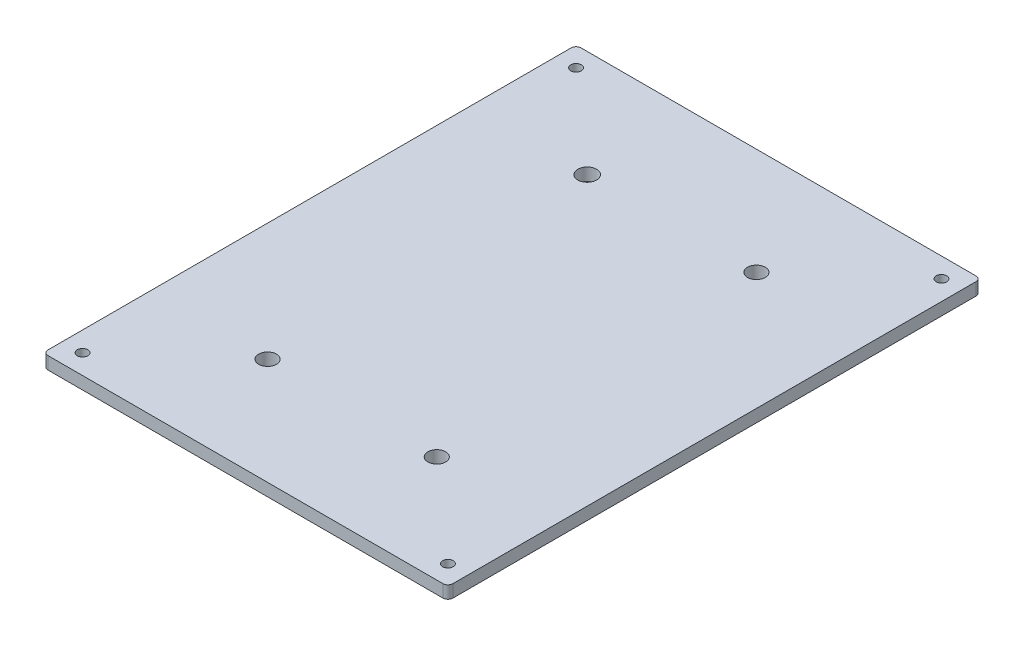
ISO-10303-21;
HEADER;
FILE_DESCRIPTION(('STEP AP214'),'2;1');
FILE_NAME('part.step','',(''),(''),'','','');
FILE_SCHEMA(('AUTOMOTIVE_DESIGN { 1 0 10303 214 1 1 1 1 }'));
ENDSEC;
DATA;
#1=APPLICATION_CONTEXT('core data for automotive mechanical design processes');
#2=APPLICATION_PROTOCOL_DEFINITION('international standard','automotive_design',2000,#1);
#3=PRODUCT_CONTEXT('',#1,'mechanical');
#4=PRODUCT('Part','Part','',(#3));
#5=PRODUCT_RELATED_PRODUCT_CATEGORY('part','',(#4));
#6=PRODUCT_DEFINITION_FORMATION('','',#4);
#7=PRODUCT_DEFINITION_CONTEXT('part definition',#1,'design');
#8=PRODUCT_DEFINITION('design','',#6,#7);
#9=PRODUCT_DEFINITION_SHAPE('','',#8);
#10=(LENGTH_UNIT() NAMED_UNIT(*) SI_UNIT(.MILLI.,.METRE.));
#11=(NAMED_UNIT(*) PLANE_ANGLE_UNIT() SI_UNIT($,.RADIAN.));
#12=(NAMED_UNIT(*) SI_UNIT($,.STERADIAN.) SOLID_ANGLE_UNIT());
#13=UNCERTAINTY_MEASURE_WITH_UNIT(LENGTH_MEASURE(1.E-05),#10,'distance_accuracy_value','');
#14=(GEOMETRIC_REPRESENTATION_CONTEXT(3) GLOBAL_UNCERTAINTY_ASSIGNED_CONTEXT((#13)) GLOBAL_UNIT_ASSIGNED_CONTEXT((#10,
#11,#12)) REPRESENTATION_CONTEXT('',''));
#15=CARTESIAN_POINT('',(0.,0.,0.));
#16=DIRECTION('',(0.,0.,1.));
#17=DIRECTION('',(1.,0.,0.));
#18=AXIS2_PLACEMENT_3D('',#15,#16,#17);
#19=CARTESIAN_POINT('',(-102.55,6.35,-135.));
#20=DIRECTION('',(1.,0.,0.));
#21=DIRECTION('',(0.,0.,-1.));
#22=AXIS2_PLACEMENT_3D('',#19,#20,#21);
#23=PLANE('',#22);
#24=DIRECTION('',(0.,0.,1.));
#25=VECTOR('',#24,1.);
#26=CARTESIAN_POINT('',(-102.55,6.35,-135.));
#27=LINE('',#26,#25);
#28=CARTESIAN_POINT('',(-102.55,6.35,-132.46));
#29=VERTEX_POINT('',#28);
#30=CARTESIAN_POINT('',(-102.55,6.35,132.46));
#31=VERTEX_POINT('',#30);
#32=EDGE_CURVE('E122',#29,#31,#27,.T.);
#33=ORIENTED_EDGE('',*,*,#32,.F.);
#34=DIRECTION('',(0.,-1.,0.));
#35=VECTOR('',#34,1.);
#36=CARTESIAN_POINT('',(-102.55,6.35,-132.46));
#37=LINE('',#36,#35);
#38=CARTESIAN_POINT('',(-102.55,0.,-132.46));
#39=VERTEX_POINT('',#38);
#40=EDGE_CURVE('E107',#29,#39,#37,.T.);
#41=ORIENTED_EDGE('',*,*,#40,.T.);
#42=DIRECTION('',(0.,0.,1.));
#43=VECTOR('',#42,1.);
#44=CARTESIAN_POINT('',(-102.55,0.,-135.));
#45=LINE('',#44,#43);
#46=CARTESIAN_POINT('',(-102.55,0.,132.46));
#47=VERTEX_POINT('',#46);
#48=EDGE_CURVE('E119',#39,#47,#45,.T.);
#49=ORIENTED_EDGE('',*,*,#48,.T.);
#50=DIRECTION('',(0.,-1.,0.));
#51=VECTOR('',#50,1.);
#52=CARTESIAN_POINT('',(-102.55,6.35,132.46));
#53=LINE('',#52,#51);
#54=EDGE_CURVE('E124',#47,#31,#53,.F.);
#55=ORIENTED_EDGE('',*,*,#54,.T.);
#56=EDGE_LOOP('',(#33,#41,#49,#55));
#57=FACE_BOUND('',#56,.T.);
#58=ADVANCED_FACE('F37',(#57),#23,.F.);
#59=CARTESIAN_POINT('',(102.55,6.35,135.));
#60=DIRECTION('',(0.,0.,-1.));
#61=DIRECTION('',(-1.,0.,0.));
#62=AXIS2_PLACEMENT_3D('',#59,#60,#61);
#63=PLANE('',#62);
#64=DIRECTION('',(1.,0.,0.));
#65=VECTOR('',#64,1.);
#66=CARTESIAN_POINT('',(102.55,0.,135.));
#67=LINE('',#66,#65);
#68=CARTESIAN_POINT('',(-100.01,0.,135.));
#69=VERTEX_POINT('',#68);
#70=CARTESIAN_POINT('',(100.01,0.,135.));
#71=VERTEX_POINT('',#70);
#72=EDGE_CURVE('E128',#69,#71,#67,.T.);
#73=ORIENTED_EDGE('',*,*,#72,.T.);
#74=DIRECTION('',(0.,-1.,0.));
#75=VECTOR('',#74,1.);
#76=CARTESIAN_POINT('',(100.01,6.35,135.));
#77=LINE('',#76,#75);
#78=CARTESIAN_POINT('',(100.01,6.35,135.));
#79=VERTEX_POINT('',#78);
#80=EDGE_CURVE('E11',#71,#79,#77,.F.);
#81=ORIENTED_EDGE('',*,*,#80,.T.);
#82=DIRECTION('',(1.,0.,0.));
#83=VECTOR('',#82,1.);
#84=CARTESIAN_POINT('',(102.55,6.35,135.));
#85=LINE('',#84,#83);
#86=CARTESIAN_POINT('',(-100.01,6.35,135.));
#87=VERTEX_POINT('',#86);
#88=EDGE_CURVE('E168',#87,#79,#85,.T.);
#89=ORIENTED_EDGE('',*,*,#88,.F.);
#90=DIRECTION('',(0.,-1.,0.));
#91=VECTOR('',#90,1.);
#92=CARTESIAN_POINT('',(-100.01,6.35,135.));
#93=LINE('',#92,#91);
#94=EDGE_CURVE('E45',#87,#69,#93,.T.);
#95=ORIENTED_EDGE('',*,*,#94,.T.);
#96=EDGE_LOOP('',(#73,#81,#89,#95));
#97=FACE_BOUND('',#96,.T.);
#98=ADVANCED_FACE('F166',(#97),#63,.F.);
#99=CARTESIAN_POINT('',(102.55,6.35,-135.));
#100=DIRECTION('',(-1.,0.,0.));
#101=DIRECTION('',(0.,0.,1.));
#102=AXIS2_PLACEMENT_3D('',#99,#100,#101);
#103=PLANE('',#102);
#104=DIRECTION('',(0.,0.,-1.));
#105=VECTOR('',#104,1.);
#106=CARTESIAN_POINT('',(102.55,0.,-135.));
#107=LINE('',#106,#105);
#108=CARTESIAN_POINT('',(102.55,0.,132.46));
#109=VERTEX_POINT('',#108);
#110=CARTESIAN_POINT('',(102.55,0.,-132.46));
#111=VERTEX_POINT('',#110);
#112=EDGE_CURVE('E132',#109,#111,#107,.T.);
#113=ORIENTED_EDGE('',*,*,#112,.T.);
#114=DIRECTION('',(0.,-1.,0.));
#115=VECTOR('',#114,1.);
#116=CARTESIAN_POINT('',(102.55,6.35,-132.46));
#117=LINE('',#116,#115);
#118=CARTESIAN_POINT('',(102.55,6.35,-132.46));
#119=VERTEX_POINT('',#118);
#120=EDGE_CURVE('E52',#111,#119,#117,.F.);
#121=ORIENTED_EDGE('',*,*,#120,.T.);
#122=DIRECTION('',(0.,0.,-1.));
#123=VECTOR('',#122,1.);
#124=CARTESIAN_POINT('',(102.55,6.35,-135.));
#125=LINE('',#124,#123);
#126=CARTESIAN_POINT('',(102.55,6.35,132.46));
#127=VERTEX_POINT('',#126);
#128=EDGE_CURVE('E176',#127,#119,#125,.T.);
#129=ORIENTED_EDGE('',*,*,#128,.F.);
#130=DIRECTION('',(0.,-1.,0.));
#131=VECTOR('',#130,1.);
#132=CARTESIAN_POINT('',(102.55,6.35,132.46));
#133=LINE('',#132,#131);
#134=EDGE_CURVE('E159',#127,#109,#133,.T.);
#135=ORIENTED_EDGE('',*,*,#134,.T.);
#136=EDGE_LOOP('',(#113,#121,#129,#135));
#137=FACE_BOUND('',#136,.T.);
#138=ADVANCED_FACE('F175',(#137),#103,.F.);
#139=CARTESIAN_POINT('',(102.55,6.35,-135.));
#140=DIRECTION('',(0.,0.,1.));
#141=DIRECTION('',(1.,0.,0.));
#142=AXIS2_PLACEMENT_3D('',#139,#140,#141);
#143=PLANE('',#142);
#144=DIRECTION('',(-1.,0.,0.));
#145=VECTOR('',#144,1.);
#146=CARTESIAN_POINT('',(102.55,0.,-135.));
#147=LINE('',#146,#145);
#148=CARTESIAN_POINT('',(100.01,0.,-135.));
#149=VERTEX_POINT('',#148);
#150=CARTESIAN_POINT('',(-100.01,0.,-135.));
#151=VERTEX_POINT('',#150);
#152=EDGE_CURVE('E142',#149,#151,#147,.T.);
#153=ORIENTED_EDGE('',*,*,#152,.T.);
#154=DIRECTION('',(0.,-1.,0.));
#155=VECTOR('',#154,1.);
#156=CARTESIAN_POINT('',(-100.01,6.35,-135.));
#157=LINE('',#156,#155);
#158=CARTESIAN_POINT('',(-100.01,6.35,-135.));
#159=VERTEX_POINT('',#158);
#160=EDGE_CURVE('E108',#151,#159,#157,.F.);
#161=ORIENTED_EDGE('',*,*,#160,.T.);
#162=DIRECTION('',(-1.,0.,0.));
#163=VECTOR('',#162,1.);
#164=CARTESIAN_POINT('',(102.55,6.35,-135.));
#165=LINE('',#164,#163);
#166=CARTESIAN_POINT('',(100.01,6.35,-135.));
#167=VERTEX_POINT('',#166);
#168=EDGE_CURVE('E138',#167,#159,#165,.T.);
#169=ORIENTED_EDGE('',*,*,#168,.F.);
#170=DIRECTION('',(0.,-1.,0.));
#171=VECTOR('',#170,1.);
#172=CARTESIAN_POINT('',(100.01,6.35,-135.));
#173=LINE('',#172,#171);
#174=EDGE_CURVE('E113',#167,#149,#173,.T.);
#175=ORIENTED_EDGE('',*,*,#174,.T.);
#176=EDGE_LOOP('',(#153,#161,#169,#175));
#177=FACE_BOUND('',#176,.T.);
#178=ADVANCED_FACE('F232',(#177),#143,.F.);
#179=CARTESIAN_POINT('',(0.,6.35,0.));
#180=DIRECTION('',(0.,-1.,0.));
#181=DIRECTION('',(0.,0.,-1.));
#182=AXIS2_PLACEMENT_3D('',#179,#180,#181);
#183=PLANE('',#182);
#184=CARTESIAN_POINT('',(42.8625,6.35,-80.9625));
#185=DIRECTION('',(0.,1.,0.));
#186=DIRECTION('',(0.,0.,1.));
#187=AXIS2_PLACEMENT_3D('',#184,#185,#186);
#188=CIRCLE('',#187,4.50000000000001);
#189=CARTESIAN_POINT('',(42.8625,6.35,-76.4625));
#190=VERTEX_POINT('',#189);
#191=EDGE_CURVE('E212',#190,#190,#188,.T.);
#192=ORIENTED_EDGE('',*,*,#191,.F.);
#193=EDGE_LOOP('',(#192));
#194=FACE_BOUND('',#193,.T.);
#195=CARTESIAN_POINT('',(42.8625,6.35,80.9625));
#196=DIRECTION('',(0.,1.,0.));
#197=DIRECTION('',(0.,0.,1.));
#198=AXIS2_PLACEMENT_3D('',#195,#196,#197);
#199=CIRCLE('',#198,4.5);
#200=CARTESIAN_POINT('',(42.8625,6.35,85.4625));
#201=VERTEX_POINT('',#200);
#202=EDGE_CURVE('E218',#201,#201,#199,.T.);
#203=ORIENTED_EDGE('',*,*,#202,.F.);
#204=EDGE_LOOP('',(#203));
#205=FACE_BOUND('',#204,.T.);
#206=CARTESIAN_POINT('',(-42.8625,6.35,80.9625));
#207=DIRECTION('',(0.,1.,0.));
#208=DIRECTION('',(0.,0.,1.));
#209=AXIS2_PLACEMENT_3D('',#206,#207,#208);
#210=CIRCLE('',#209,4.5);
#211=CARTESIAN_POINT('',(-42.8625,6.35,85.4625));
#212=VERTEX_POINT('',#211);
#213=EDGE_CURVE('E206',#212,#212,#210,.T.);
#214=ORIENTED_EDGE('',*,*,#213,.F.);
#215=EDGE_LOOP('',(#214));
#216=FACE_BOUND('',#215,.T.);
#217=CARTESIAN_POINT('',(-42.8625,6.35,-80.9625));
#218=DIRECTION('',(0.,1.,0.));
#219=DIRECTION('',(0.,0.,1.));
#220=AXIS2_PLACEMENT_3D('',#217,#218,#219);
#221=CIRCLE('',#220,4.7625);
#222=CARTESIAN_POINT('',(-42.8625,6.35,-76.2));
#223=VERTEX_POINT('',#222);
#224=EDGE_CURVE('E189',#223,#223,#221,.T.);
#225=ORIENTED_EDGE('',*,*,#224,.F.);
#226=EDGE_LOOP('',(#225));
#227=FACE_BOUND('',#226,.T.);
#228=CARTESIAN_POINT('',(-92.55,6.35,-125.));
#229=DIRECTION('',(0.,1.,0.));
#230=DIRECTION('',(0.,0.,1.));
#231=AXIS2_PLACEMENT_3D('',#228,#229,#230);
#232=CIRCLE('',#231,2.665);
#233=CARTESIAN_POINT('',(-92.55,6.35,-122.335));
#234=VERTEX_POINT('',#233);
#235=EDGE_CURVE('E188',#234,#234,#232,.T.);
#236=ORIENTED_EDGE('',*,*,#235,.F.);
#237=EDGE_LOOP('',(#236));
#238=FACE_BOUND('',#237,.T.);
#239=CARTESIAN_POINT('',(92.5500000000001,6.35,-125.));
#240=DIRECTION('',(0.,1.,0.));
#241=DIRECTION('',(0.,0.,1.));
#242=AXIS2_PLACEMENT_3D('',#239,#240,#241);
#243=CIRCLE('',#242,2.665);
#244=CARTESIAN_POINT('',(92.5500000000001,6.35,-122.335));
#245=VERTEX_POINT('',#244);
#246=EDGE_CURVE('E195',#245,#245,#243,.T.);
#247=ORIENTED_EDGE('',*,*,#246,.F.);
#248=EDGE_LOOP('',(#247));
#249=FACE_BOUND('',#248,.T.);
#250=CARTESIAN_POINT('',(92.5500000000001,6.35,125.));
#251=DIRECTION('',(0.,1.,0.));
#252=DIRECTION('',(0.,0.,1.));
#253=AXIS2_PLACEMENT_3D('',#250,#251,#252);
#254=CIRCLE('',#253,2.665);
#255=CARTESIAN_POINT('',(92.5500000000001,6.35,127.665));
#256=VERTEX_POINT('',#255);
#257=EDGE_CURVE('E183',#256,#256,#254,.T.);
#258=ORIENTED_EDGE('',*,*,#257,.F.);
#259=EDGE_LOOP('',(#258));
#260=FACE_BOUND('',#259,.T.);
#261=CARTESIAN_POINT('',(-92.55,6.35,125.));
#262=DIRECTION('',(0.,1.,0.));
#263=DIRECTION('',(0.,0.,1.));
#264=AXIS2_PLACEMENT_3D('',#261,#262,#263);
#265=CIRCLE('',#264,2.665);
#266=CARTESIAN_POINT('',(-92.55,6.35,127.665));
#267=VERTEX_POINT('',#266);
#268=EDGE_CURVE('E129',#267,#267,#265,.T.);
#269=ORIENTED_EDGE('',*,*,#268,.F.);
#270=EDGE_LOOP('',(#269));
#271=FACE_BOUND('',#270,.T.);
#272=ORIENTED_EDGE('',*,*,#168,.T.);
#273=CARTESIAN_POINT('',(-100.01,6.35,-132.46));
#274=DIRECTION('',(0.,-1.,0.));
#275=DIRECTION('',(0.,0.,-1.));
#276=AXIS2_PLACEMENT_3D('',#273,#274,#275);
#277=CIRCLE('',#276,2.54);
#278=EDGE_CURVE('E157',#159,#29,#277,.F.);
#279=ORIENTED_EDGE('',*,*,#278,.T.);
#280=ORIENTED_EDGE('',*,*,#32,.T.);
#281=CARTESIAN_POINT('',(-100.01,6.35,132.46));
#282=DIRECTION('',(0.,-1.,0.));
#283=DIRECTION('',(0.,0.,-1.));
#284=AXIS2_PLACEMENT_3D('',#281,#282,#283);
#285=CIRCLE('',#284,2.54);
#286=EDGE_CURVE('E152',#31,#87,#285,.F.);
#287=ORIENTED_EDGE('',*,*,#286,.T.);
#288=ORIENTED_EDGE('',*,*,#88,.T.);
#289=CARTESIAN_POINT('',(100.01,6.35,132.46));
#290=DIRECTION('',(0.,-1.,0.));
#291=DIRECTION('',(0.,0.,-1.));
#292=AXIS2_PLACEMENT_3D('',#289,#290,#291);
#293=CIRCLE('',#292,2.54);
#294=EDGE_CURVE('E59',#79,#127,#293,.F.);
#295=ORIENTED_EDGE('',*,*,#294,.T.);
#296=ORIENTED_EDGE('',*,*,#128,.T.);
#297=CARTESIAN_POINT('',(100.01,6.35,-132.46));
#298=DIRECTION('',(0.,-1.,0.));
#299=DIRECTION('',(0.,0.,-1.));
#300=AXIS2_PLACEMENT_3D('',#297,#298,#299);
#301=CIRCLE('',#300,2.54);
#302=EDGE_CURVE('E155',#119,#167,#301,.F.);
#303=ORIENTED_EDGE('',*,*,#302,.T.);
#304=EDGE_LOOP('',(#272,#279,#280,#287,#288,#295,#296,#303));
#305=FACE_BOUND('',#304,.T.);
#306=ADVANCED_FACE('F229',(#194,#205,#216,#227,#238,#249,#260,#271,#305),#183,.F.);
#307=CARTESIAN_POINT('',(0.,0.,0.));
#308=DIRECTION('',(0.,-1.,0.));
#309=DIRECTION('',(0.,0.,-1.));
#310=AXIS2_PLACEMENT_3D('',#307,#308,#309);
#311=PLANE('',#310);
#312=CARTESIAN_POINT('',(42.8625,0.,-80.9625));
#313=DIRECTION('',(0.,-1.,0.));
#314=DIRECTION('',(0.,0.,-1.));
#315=AXIS2_PLACEMENT_3D('',#312,#313,#314);
#316=CIRCLE('',#315,4.50000000000001);
#317=CARTESIAN_POINT('',(42.8625,0.,-85.4625));
#318=VERTEX_POINT('',#317);
#319=EDGE_CURVE('E209',#318,#318,#316,.F.);
#320=ORIENTED_EDGE('',*,*,#319,.T.);
#321=EDGE_LOOP('',(#320));
#322=FACE_BOUND('',#321,.T.);
#323=CARTESIAN_POINT('',(42.8625,0.,80.9625));
#324=DIRECTION('',(0.,-1.,0.));
#325=DIRECTION('',(0.,0.,-1.));
#326=AXIS2_PLACEMENT_3D('',#323,#324,#325);
#327=CIRCLE('',#326,4.5);
#328=CARTESIAN_POINT('',(42.8625,0.,76.4625));
#329=VERTEX_POINT('',#328);
#330=EDGE_CURVE('E215',#329,#329,#327,.F.);
#331=ORIENTED_EDGE('',*,*,#330,.T.);
#332=EDGE_LOOP('',(#331));
#333=FACE_BOUND('',#332,.T.);
#334=CARTESIAN_POINT('',(-42.8625,0.,80.9625));
#335=DIRECTION('',(0.,-1.,0.));
#336=DIRECTION('',(0.,0.,-1.));
#337=AXIS2_PLACEMENT_3D('',#334,#335,#336);
#338=CIRCLE('',#337,4.5);
#339=CARTESIAN_POINT('',(-42.8625,0.,76.4625));
#340=VERTEX_POINT('',#339);
#341=EDGE_CURVE('E221',#340,#340,#338,.F.);
#342=ORIENTED_EDGE('',*,*,#341,.T.);
#343=EDGE_LOOP('',(#342));
#344=FACE_BOUND('',#343,.T.);
#345=CARTESIAN_POINT('',(-42.8625,0.,-80.9625));
#346=DIRECTION('',(0.,-1.,0.));
#347=DIRECTION('',(0.,0.,-1.));
#348=AXIS2_PLACEMENT_3D('',#345,#346,#347);
#349=CIRCLE('',#348,4.7625);
#350=CARTESIAN_POINT('',(-42.8625,0.,-85.725));
#351=VERTEX_POINT('',#350);
#352=EDGE_CURVE('E203',#351,#351,#349,.F.);
#353=ORIENTED_EDGE('',*,*,#352,.T.);
#354=EDGE_LOOP('',(#353));
#355=FACE_BOUND('',#354,.T.);
#356=CARTESIAN_POINT('',(-92.55,0.,-125.));
#357=DIRECTION('',(0.,-1.,0.));
#358=DIRECTION('',(0.,0.,-1.));
#359=AXIS2_PLACEMENT_3D('',#356,#357,#358);
#360=CIRCLE('',#359,2.665);
#361=CARTESIAN_POINT('',(-92.55,0.,-127.665));
#362=VERTEX_POINT('',#361);
#363=EDGE_CURVE('E185',#362,#362,#360,.F.);
#364=ORIENTED_EDGE('',*,*,#363,.T.);
#365=EDGE_LOOP('',(#364));
#366=FACE_BOUND('',#365,.T.);
#367=CARTESIAN_POINT('',(92.5500000000001,0.,-125.));
#368=DIRECTION('',(0.,-1.,0.));
#369=DIRECTION('',(0.,0.,-1.));
#370=AXIS2_PLACEMENT_3D('',#367,#368,#369);
#371=CIRCLE('',#370,2.665);
#372=CARTESIAN_POINT('',(92.5500000000001,0.,-127.665));
#373=VERTEX_POINT('',#372);
#374=EDGE_CURVE('E192',#373,#373,#371,.F.);
#375=ORIENTED_EDGE('',*,*,#374,.T.);
#376=EDGE_LOOP('',(#375));
#377=FACE_BOUND('',#376,.T.);
#378=CARTESIAN_POINT('',(92.5500000000001,0.,125.));
#379=DIRECTION('',(0.,-1.,0.));
#380=DIRECTION('',(0.,0.,-1.));
#381=AXIS2_PLACEMENT_3D('',#378,#379,#380);
#382=CIRCLE('',#381,2.665);
#383=CARTESIAN_POINT('',(92.5500000000001,0.,122.335));
#384=VERTEX_POINT('',#383);
#385=EDGE_CURVE('E198',#384,#384,#382,.F.);
#386=ORIENTED_EDGE('',*,*,#385,.T.);
#387=EDGE_LOOP('',(#386));
#388=FACE_BOUND('',#387,.T.);
#389=CARTESIAN_POINT('',(-92.55,0.,125.));
#390=DIRECTION('',(0.,-1.,0.));
#391=DIRECTION('',(0.,0.,-1.));
#392=AXIS2_PLACEMENT_3D('',#389,#390,#391);
#393=CIRCLE('',#392,2.665);
#394=CARTESIAN_POINT('',(-92.55,0.,122.335));
#395=VERTEX_POINT('',#394);
#396=EDGE_CURVE('E135',#395,#395,#393,.F.);
#397=ORIENTED_EDGE('',*,*,#396,.T.);
#398=EDGE_LOOP('',(#397));
#399=FACE_BOUND('',#398,.T.);
#400=ORIENTED_EDGE('',*,*,#48,.F.);
#401=CARTESIAN_POINT('',(-100.01,0.,-132.46));
#402=DIRECTION('',(0.,-1.,0.));
#403=DIRECTION('',(0.,0.,-1.));
#404=AXIS2_PLACEMENT_3D('',#401,#402,#403);
#405=CIRCLE('',#404,2.54);
#406=EDGE_CURVE('E103',#39,#151,#405,.T.);
#407=ORIENTED_EDGE('',*,*,#406,.T.);
#408=ORIENTED_EDGE('',*,*,#152,.F.);
#409=CARTESIAN_POINT('',(100.01,0.,-132.46));
#410=DIRECTION('',(0.,-1.,0.));
#411=DIRECTION('',(0.,0.,-1.));
#412=AXIS2_PLACEMENT_3D('',#409,#410,#411);
#413=CIRCLE('',#412,2.54);
#414=EDGE_CURVE('E114',#149,#111,#413,.T.);
#415=ORIENTED_EDGE('',*,*,#414,.T.);
#416=ORIENTED_EDGE('',*,*,#112,.F.);
#417=CARTESIAN_POINT('',(100.01,0.,132.46));
#418=DIRECTION('',(0.,-1.,0.));
#419=DIRECTION('',(0.,0.,-1.));
#420=AXIS2_PLACEMENT_3D('',#417,#418,#419);
#421=CIRCLE('',#420,2.54);
#422=EDGE_CURVE('E146',#109,#71,#421,.T.);
#423=ORIENTED_EDGE('',*,*,#422,.T.);
#424=ORIENTED_EDGE('',*,*,#72,.F.);
#425=CARTESIAN_POINT('',(-100.01,0.,132.46));
#426=DIRECTION('',(0.,-1.,0.));
#427=DIRECTION('',(0.,0.,-1.));
#428=AXIS2_PLACEMENT_3D('',#425,#426,#427);
#429=CIRCLE('',#428,2.54);
#430=EDGE_CURVE('E123',#69,#47,#429,.T.);
#431=ORIENTED_EDGE('',*,*,#430,.T.);
#432=EDGE_LOOP('',(#400,#407,#408,#415,#416,#423,#424,#431));
#433=FACE_BOUND('',#432,.T.);
#434=ADVANCED_FACE('F126',(#322,#333,#344,#355,#366,#377,#388,#399,#433),#311,.T.);
#435=CARTESIAN_POINT('',(-100.01,6.35,-132.46));
#436=DIRECTION('',(0.,-1.,0.));
#437=DIRECTION('',(0.,0.,-1.));
#438=AXIS2_PLACEMENT_3D('',#435,#436,#437);
#439=CYLINDRICAL_SURFACE('',#438,2.54);
#440=ORIENTED_EDGE('',*,*,#278,.F.);
#441=ORIENTED_EDGE('',*,*,#160,.F.);
#442=ORIENTED_EDGE('',*,*,#406,.F.);
#443=ORIENTED_EDGE('',*,*,#40,.F.);
#444=EDGE_LOOP('',(#440,#441,#442,#443));
#445=FACE_BOUND('',#444,.T.);
#446=ADVANCED_FACE('F106',(#445),#439,.T.);
#447=CARTESIAN_POINT('',(100.01,6.35,-132.46));
#448=DIRECTION('',(0.,-1.,0.));
#449=DIRECTION('',(0.,0.,-1.));
#450=AXIS2_PLACEMENT_3D('',#447,#448,#449);
#451=CYLINDRICAL_SURFACE('',#450,2.54);
#452=ORIENTED_EDGE('',*,*,#302,.F.);
#453=ORIENTED_EDGE('',*,*,#120,.F.);
#454=ORIENTED_EDGE('',*,*,#414,.F.);
#455=ORIENTED_EDGE('',*,*,#174,.F.);
#456=EDGE_LOOP('',(#452,#453,#454,#455));
#457=FACE_BOUND('',#456,.T.);
#458=ADVANCED_FACE('F248',(#457),#451,.T.);
#459=CARTESIAN_POINT('',(100.01,6.35,132.46));
#460=DIRECTION('',(0.,-1.,0.));
#461=DIRECTION('',(0.,0.,-1.));
#462=AXIS2_PLACEMENT_3D('',#459,#460,#461);
#463=CYLINDRICAL_SURFACE('',#462,2.54);
#464=ORIENTED_EDGE('',*,*,#294,.F.);
#465=ORIENTED_EDGE('',*,*,#80,.F.);
#466=ORIENTED_EDGE('',*,*,#422,.F.);
#467=ORIENTED_EDGE('',*,*,#134,.F.);
#468=EDGE_LOOP('',(#464,#465,#466,#467));
#469=FACE_BOUND('',#468,.T.);
#470=ADVANCED_FACE('F174',(#469),#463,.T.);
#471=CARTESIAN_POINT('',(-100.01,6.35,132.46));
#472=DIRECTION('',(0.,-1.,0.));
#473=DIRECTION('',(0.,0.,-1.));
#474=AXIS2_PLACEMENT_3D('',#471,#472,#473);
#475=CYLINDRICAL_SURFACE('',#474,2.54);
#476=ORIENTED_EDGE('',*,*,#286,.F.);
#477=ORIENTED_EDGE('',*,*,#54,.F.);
#478=ORIENTED_EDGE('',*,*,#430,.F.);
#479=ORIENTED_EDGE('',*,*,#94,.F.);
#480=EDGE_LOOP('',(#476,#477,#478,#479));
#481=FACE_BOUND('',#480,.T.);
#482=ADVANCED_FACE('F39',(#481),#475,.T.);
#483=CARTESIAN_POINT('',(-92.55,-0.00100000000000013,125.));
#484=DIRECTION('',(0.,1.,0.));
#485=DIRECTION('',(0.,0.,1.));
#486=AXIS2_PLACEMENT_3D('',#483,#484,#485);
#487=CYLINDRICAL_SURFACE('',#486,2.665);
#488=ORIENTED_EDGE('',*,*,#396,.F.);
#489=EDGE_LOOP('',(#488));
#490=FACE_BOUND('',#489,.T.);
#491=ORIENTED_EDGE('',*,*,#268,.T.);
#492=EDGE_LOOP('',(#491));
#493=FACE_BOUND('',#492,.T.);
#494=ADVANCED_FACE('F270',(#490,#493),#487,.F.);
#495=CARTESIAN_POINT('',(92.5500000000001,-0.00100000000000013,125.));
#496=DIRECTION('',(0.,1.,0.));
#497=DIRECTION('',(0.,0.,1.));
#498=AXIS2_PLACEMENT_3D('',#495,#496,#497);
#499=CYLINDRICAL_SURFACE('',#498,2.665);
#500=ORIENTED_EDGE('',*,*,#385,.F.);
#501=EDGE_LOOP('',(#500));
#502=FACE_BOUND('',#501,.T.);
#503=ORIENTED_EDGE('',*,*,#257,.T.);
#504=EDGE_LOOP('',(#503));
#505=FACE_BOUND('',#504,.T.);
#506=ADVANCED_FACE('F273',(#502,#505),#499,.F.);
#507=CARTESIAN_POINT('',(92.5500000000001,-0.00100000000000013,-125.));
#508=DIRECTION('',(0.,1.,0.));
#509=DIRECTION('',(0.,0.,1.));
#510=AXIS2_PLACEMENT_3D('',#507,#508,#509);
#511=CYLINDRICAL_SURFACE('',#510,2.665);
#512=ORIENTED_EDGE('',*,*,#374,.F.);
#513=EDGE_LOOP('',(#512));
#514=FACE_BOUND('',#513,.T.);
#515=ORIENTED_EDGE('',*,*,#246,.T.);
#516=EDGE_LOOP('',(#515));
#517=FACE_BOUND('',#516,.T.);
#518=ADVANCED_FACE('F279',(#514,#517),#511,.F.);
#519=CARTESIAN_POINT('',(-92.55,-0.00100000000000013,-125.));
#520=DIRECTION('',(0.,1.,0.));
#521=DIRECTION('',(0.,0.,1.));
#522=AXIS2_PLACEMENT_3D('',#519,#520,#521);
#523=CYLINDRICAL_SURFACE('',#522,2.665);
#524=ORIENTED_EDGE('',*,*,#363,.F.);
#525=EDGE_LOOP('',(#524));
#526=FACE_BOUND('',#525,.T.);
#527=ORIENTED_EDGE('',*,*,#235,.T.);
#528=EDGE_LOOP('',(#527));
#529=FACE_BOUND('',#528,.T.);
#530=ADVANCED_FACE('F275',(#526,#529),#523,.F.);
#531=CARTESIAN_POINT('',(-42.8625,-0.00100000000000013,-80.9625));
#532=DIRECTION('',(0.,1.,0.));
#533=DIRECTION('',(0.,0.,1.));
#534=AXIS2_PLACEMENT_3D('',#531,#532,#533);
#535=CYLINDRICAL_SURFACE('',#534,4.7625);
#536=ORIENTED_EDGE('',*,*,#352,.F.);
#537=EDGE_LOOP('',(#536));
#538=FACE_BOUND('',#537,.T.);
#539=ORIENTED_EDGE('',*,*,#224,.T.);
#540=EDGE_LOOP('',(#539));
#541=FACE_BOUND('',#540,.T.);
#542=ADVANCED_FACE('F278',(#538,#541),#535,.F.);
#543=CARTESIAN_POINT('',(-42.8625,-0.00100000000000013,80.9625));
#544=DIRECTION('',(0.,1.,0.));
#545=DIRECTION('',(0.,0.,1.));
#546=AXIS2_PLACEMENT_3D('',#543,#544,#545);
#547=CYLINDRICAL_SURFACE('',#546,4.5);
#548=ORIENTED_EDGE('',*,*,#341,.F.);
#549=EDGE_LOOP('',(#548));
#550=FACE_BOUND('',#549,.T.);
#551=ORIENTED_EDGE('',*,*,#213,.T.);
#552=EDGE_LOOP('',(#551));
#553=FACE_BOUND('',#552,.T.);
#554=ADVANCED_FACE('F227',(#550,#553),#547,.F.);
#555=CARTESIAN_POINT('',(42.8625,-0.00100000000000013,80.9625));
#556=DIRECTION('',(0.,1.,0.));
#557=DIRECTION('',(0.,0.,1.));
#558=AXIS2_PLACEMENT_3D('',#555,#556,#557);
#559=CYLINDRICAL_SURFACE('',#558,4.5);
#560=ORIENTED_EDGE('',*,*,#330,.F.);
#561=EDGE_LOOP('',(#560));
#562=FACE_BOUND('',#561,.T.);
#563=ORIENTED_EDGE('',*,*,#202,.T.);
#564=EDGE_LOOP('',(#563));
#565=FACE_BOUND('',#564,.T.);
#566=ADVANCED_FACE('F293',(#562,#565),#559,.F.);
#567=CARTESIAN_POINT('',(42.8625,-0.00100000000000013,-80.9625));
#568=DIRECTION('',(0.,1.,0.));
#569=DIRECTION('',(0.,0.,1.));
#570=AXIS2_PLACEMENT_3D('',#567,#568,#569);
#571=CYLINDRICAL_SURFACE('',#570,4.50000000000001);
#572=ORIENTED_EDGE('',*,*,#319,.F.);
#573=EDGE_LOOP('',(#572));
#574=FACE_BOUND('',#573,.T.);
#575=ORIENTED_EDGE('',*,*,#191,.T.);
#576=EDGE_LOOP('',(#575));
#577=FACE_BOUND('',#576,.T.);
#578=ADVANCED_FACE('F290',(#574,#577),#571,.F.);
#579=CLOSED_SHELL('',(#58,#98,#138,#178,#306,#434,#446,#458,#470,#482,#494,#506,#518,#530,#542,
#554,#566,#578));
#580=MANIFOLD_SOLID_BREP('B2',#579);
#581=ADVANCED_BREP_SHAPE_REPRESENTATION('',(#18,#580),#14);
#582=SHAPE_DEFINITION_REPRESENTATION(#9,#581);
ENDSEC;
END-ISO-10303-21;
